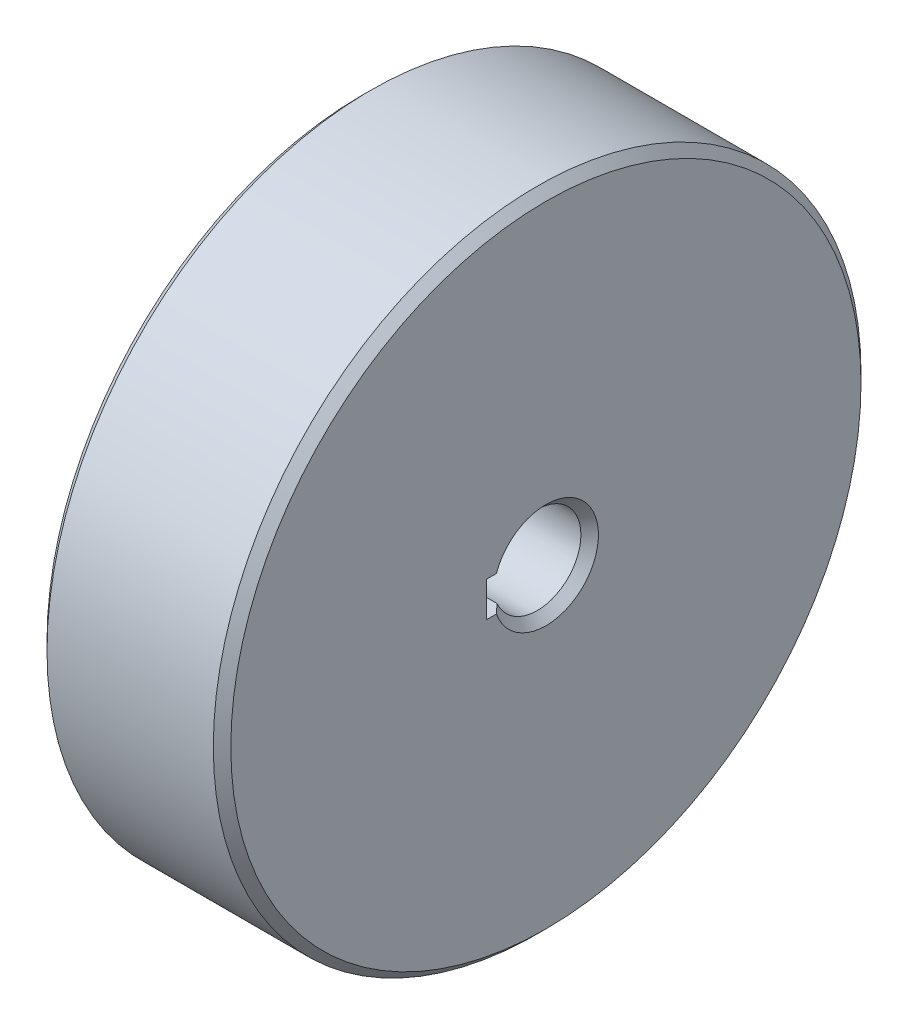
ISO-10303-21;
HEADER;
FILE_DESCRIPTION(('STEP AP214'),'2;1');
FILE_NAME('part.step','',(''),(''),'','','');
FILE_SCHEMA(('AUTOMOTIVE_DESIGN { 1 0 10303 214 1 1 1 1 }'));
ENDSEC;
DATA;
#1=APPLICATION_CONTEXT('core data for automotive mechanical design processes');
#2=APPLICATION_PROTOCOL_DEFINITION('international standard','automotive_design',2000,#1);
#3=PRODUCT_CONTEXT('',#1,'mechanical');
#4=PRODUCT('Part','Part','',(#3));
#5=PRODUCT_RELATED_PRODUCT_CATEGORY('part','',(#4));
#6=PRODUCT_DEFINITION_FORMATION('','',#4);
#7=PRODUCT_DEFINITION_CONTEXT('part definition',#1,'design');
#8=PRODUCT_DEFINITION('design','',#6,#7);
#9=PRODUCT_DEFINITION_SHAPE('','',#8);
#10=(LENGTH_UNIT() NAMED_UNIT(*) SI_UNIT(.MILLI.,.METRE.));
#11=(NAMED_UNIT(*) PLANE_ANGLE_UNIT() SI_UNIT($,.RADIAN.));
#12=(NAMED_UNIT(*) SI_UNIT($,.STERADIAN.) SOLID_ANGLE_UNIT());
#13=UNCERTAINTY_MEASURE_WITH_UNIT(LENGTH_MEASURE(1.E-05),#10,'distance_accuracy_value','');
#14=(GEOMETRIC_REPRESENTATION_CONTEXT(3) GLOBAL_UNCERTAINTY_ASSIGNED_CONTEXT((#13)) GLOBAL_UNIT_ASSIGNED_CONTEXT((#10,
#11,#12)) REPRESENTATION_CONTEXT('',''));
#15=CARTESIAN_POINT('',(0.,0.,0.));
#16=DIRECTION('',(0.,0.,1.));
#17=DIRECTION('',(1.,0.,0.));
#18=AXIS2_PLACEMENT_3D('',#15,#16,#17);
#19=CARTESIAN_POINT('',(0.,0.,37.));
#20=DIRECTION('',(-1.,0.,0.));
#21=DIRECTION('',(0.,0.,1.));
#22=AXIS2_PLACEMENT_3D('',#19,#20,#21);
#23=PLANE('',#22);
#24=CARTESIAN_POINT('',(0.,0.,0.));
#25=DIRECTION('',(-1.,0.,0.));
#26=DIRECTION('',(0.,0.,1.));
#27=AXIS2_PLACEMENT_3D('',#24,#25,#26);
#28=CIRCLE('',#27,36.);
#29=CARTESIAN_POINT('',(0.,0.,36.));
#30=VERTEX_POINT('',#29);
#31=EDGE_CURVE('E184',#30,#30,#28,.T.);
#32=ORIENTED_EDGE('',*,*,#31,.T.);
#33=EDGE_LOOP('',(#32));
#34=FACE_BOUND('',#33,.T.);
#35=DIRECTION('',(0.,0.,-1.));
#36=VECTOR('',#35,1.);
#37=CARTESIAN_POINT('',(0.,-2.,4.58257569495584));
#38=LINE('',#37,#36);
#39=CARTESIAN_POINT('',(0.,-2.,6.8));
#40=VERTEX_POINT('',#39);
#41=CARTESIAN_POINT('',(0.,-2.,5.65685424949237));
#42=VERTEX_POINT('',#41);
#43=EDGE_CURVE('E95',#40,#42,#38,.T.);
#44=ORIENTED_EDGE('',*,*,#43,.T.);
#45=CARTESIAN_POINT('',(0.,0.,0.));
#46=DIRECTION('',(-1.,0.,0.));
#47=DIRECTION('',(0.,0.,1.));
#48=AXIS2_PLACEMENT_3D('',#45,#46,#47);
#49=CIRCLE('',#48,5.99999999999999);
#50=CARTESIAN_POINT('',(0.,2.,5.65685424949237));
#51=VERTEX_POINT('',#50);
#52=EDGE_CURVE('E55',#42,#51,#49,.F.);
#53=ORIENTED_EDGE('',*,*,#52,.T.);
#54=DIRECTION('',(0.,0.,1.));
#55=VECTOR('',#54,1.);
#56=CARTESIAN_POINT('',(0.,2.,4.58257569495584));
#57=LINE('',#56,#55);
#58=CARTESIAN_POINT('',(0.,2.,6.8));
#59=VERTEX_POINT('',#58);
#60=EDGE_CURVE('E113',#51,#59,#57,.T.);
#61=ORIENTED_EDGE('',*,*,#60,.T.);
#62=DIRECTION('',(0.,-1.,0.));
#63=VECTOR('',#62,1.);
#64=CARTESIAN_POINT('',(0.,-2.,6.8));
#65=LINE('',#64,#63);
#66=EDGE_CURVE('E102',#59,#40,#65,.T.);
#67=ORIENTED_EDGE('',*,*,#66,.T.);
#68=EDGE_LOOP('',(#44,#53,#61,#67));
#69=FACE_BOUND('',#68,.T.);
#70=ADVANCED_FACE('F32',(#34,#69),#23,.T.);
#71=CARTESIAN_POINT('',(0.,0.,0.));
#72=DIRECTION('',(-1.,0.,0.));
#73=DIRECTION('',(0.,0.,1.));
#74=AXIS2_PLACEMENT_3D('',#71,#72,#73);
#75=CYLINDRICAL_SURFACE('',#74,5.);
#76=DIRECTION('',(-1.,0.,0.));
#77=VECTOR('',#76,1.);
#78=CARTESIAN_POINT('',(21.,2.,4.58257569495584));
#79=LINE('',#78,#77);
#80=CARTESIAN_POINT('',(20.,2.,4.58257569495584));
#81=VERTEX_POINT('',#80);
#82=CARTESIAN_POINT('',(0.999999999999982,2.,4.58257569495584));
#83=VERTEX_POINT('',#82);
#84=EDGE_CURVE('E103',#81,#83,#79,.T.);
#85=ORIENTED_EDGE('',*,*,#84,.T.);
#86=CARTESIAN_POINT('',(0.999999999999983,0.,0.));
#87=DIRECTION('',(-1.,0.,0.));
#88=DIRECTION('',(0.,0.,1.));
#89=AXIS2_PLACEMENT_3D('',#86,#87,#88);
#90=CIRCLE('',#89,5.);
#91=CARTESIAN_POINT('',(0.999999999999982,-2.,4.58257569495584));
#92=VERTEX_POINT('',#91);
#93=EDGE_CURVE('E124',#83,#92,#90,.T.);
#94=ORIENTED_EDGE('',*,*,#93,.T.);
#95=DIRECTION('',(-1.,0.,0.));
#96=VECTOR('',#95,1.);
#97=CARTESIAN_POINT('',(21.,-2.,4.58257569495584));
#98=LINE('',#97,#96);
#99=CARTESIAN_POINT('',(20.,-2.,4.58257569495584));
#100=VERTEX_POINT('',#99);
#101=EDGE_CURVE('E110',#100,#92,#98,.T.);
#102=ORIENTED_EDGE('',*,*,#101,.F.);
#103=CARTESIAN_POINT('',(20.,0.,0.));
#104=DIRECTION('',(1.,0.,0.));
#105=DIRECTION('',(0.,0.,-1.));
#106=AXIS2_PLACEMENT_3D('',#103,#104,#105);
#107=CIRCLE('',#106,5.);
#108=EDGE_CURVE('E122',#100,#81,#107,.T.);
#109=ORIENTED_EDGE('',*,*,#108,.T.);
#110=EDGE_LOOP('',(#85,#94,#102,#109));
#111=FACE_BOUND('',#110,.T.);
#112=ADVANCED_FACE('F174',(#111),#75,.F.);
#113=CARTESIAN_POINT('',(21.,0.,37.));
#114=DIRECTION('',(1.,0.,0.));
#115=DIRECTION('',(0.,0.,-1.));
#116=AXIS2_PLACEMENT_3D('',#113,#114,#115);
#117=PLANE('',#116);
#118=CARTESIAN_POINT('',(21.,0.,0.));
#119=DIRECTION('',(1.,0.,0.));
#120=DIRECTION('',(0.,0.,-1.));
#121=AXIS2_PLACEMENT_3D('',#118,#119,#120);
#122=CIRCLE('',#121,36.);
#123=CARTESIAN_POINT('',(21.,0.,-36.));
#124=VERTEX_POINT('',#123);
#125=EDGE_CURVE('E193',#124,#124,#122,.T.);
#126=ORIENTED_EDGE('',*,*,#125,.T.);
#127=EDGE_LOOP('',(#126));
#128=FACE_BOUND('',#127,.T.);
#129=DIRECTION('',(0.,0.,1.));
#130=VECTOR('',#129,1.);
#131=CARTESIAN_POINT('',(21.,2.,4.58257569495584));
#132=LINE('',#131,#130);
#133=CARTESIAN_POINT('',(21.,2.,5.65685424949237));
#134=VERTEX_POINT('',#133);
#135=CARTESIAN_POINT('',(21.,2.,6.8));
#136=VERTEX_POINT('',#135);
#137=EDGE_CURVE('E85',#134,#136,#132,.T.);
#138=ORIENTED_EDGE('',*,*,#137,.F.);
#139=CARTESIAN_POINT('',(21.,0.,0.));
#140=DIRECTION('',(1.,0.,0.));
#141=DIRECTION('',(0.,0.,-1.));
#142=AXIS2_PLACEMENT_3D('',#139,#140,#141);
#143=CIRCLE('',#142,5.99999999999999);
#144=CARTESIAN_POINT('',(21.,-2.,5.65685424949237));
#145=VERTEX_POINT('',#144);
#146=EDGE_CURVE('E192',#134,#145,#143,.F.);
#147=ORIENTED_EDGE('',*,*,#146,.T.);
#148=DIRECTION('',(0.,0.,-1.));
#149=VECTOR('',#148,1.);
#150=CARTESIAN_POINT('',(21.,-2.,4.58257569495584));
#151=LINE('',#150,#149);
#152=CARTESIAN_POINT('',(21.,-2.,6.8));
#153=VERTEX_POINT('',#152);
#154=EDGE_CURVE('E108',#153,#145,#151,.T.);
#155=ORIENTED_EDGE('',*,*,#154,.F.);
#156=DIRECTION('',(0.,-1.,0.));
#157=VECTOR('',#156,1.);
#158=CARTESIAN_POINT('',(21.,-2.,6.8));
#159=LINE('',#158,#157);
#160=EDGE_CURVE('E94',#136,#153,#159,.T.);
#161=ORIENTED_EDGE('',*,*,#160,.F.);
#162=EDGE_LOOP('',(#138,#147,#155,#161));
#163=FACE_BOUND('',#162,.T.);
#164=ADVANCED_FACE('F106',(#128,#163),#117,.T.);
#165=CARTESIAN_POINT('',(0.,0.,0.));
#166=DIRECTION('',(-1.,0.,0.));
#167=DIRECTION('',(0.,0.,1.));
#168=AXIS2_PLACEMENT_3D('',#165,#166,#167);
#169=CYLINDRICAL_SURFACE('',#168,37.);
#170=CARTESIAN_POINT('',(0.99999999999998,0.,0.));
#171=DIRECTION('',(-1.,0.,0.));
#172=DIRECTION('',(0.,0.,1.));
#173=AXIS2_PLACEMENT_3D('',#170,#171,#172);
#174=CIRCLE('',#173,37.);
#175=CARTESIAN_POINT('',(0.99999999999998,0.,37.));
#176=VERTEX_POINT('',#175);
#177=EDGE_CURVE('E11',#176,#176,#174,.F.);
#178=ORIENTED_EDGE('',*,*,#177,.T.);
#179=EDGE_LOOP('',(#178));
#180=FACE_BOUND('',#179,.T.);
#181=CARTESIAN_POINT('',(20.,0.,0.));
#182=DIRECTION('',(1.,0.,0.));
#183=DIRECTION('',(0.,0.,-1.));
#184=AXIS2_PLACEMENT_3D('',#181,#182,#183);
#185=CIRCLE('',#184,37.);
#186=CARTESIAN_POINT('',(20.,0.,-37.));
#187=VERTEX_POINT('',#186);
#188=EDGE_CURVE('E40',#187,#187,#185,.F.);
#189=ORIENTED_EDGE('',*,*,#188,.T.);
#190=EDGE_LOOP('',(#189));
#191=FACE_BOUND('',#190,.T.);
#192=ADVANCED_FACE('F167',(#180,#191),#169,.T.);
#193=CARTESIAN_POINT('',(21.,2.,4.58257569495584));
#194=DIRECTION('',(0.,-1.,0.));
#195=DIRECTION('',(0.,0.,-1.));
#196=AXIS2_PLACEMENT_3D('',#193,#194,#195);
#197=PLANE('',#196);
#198=ORIENTED_EDGE('',*,*,#60,.F.);
#199=CARTESIAN_POINT('',(0.,2.,5.65685424949237));
#200=CARTESIAN_POINT('',(0.0839014006342072,2.,5.56786120487213));
#201=CARTESIAN_POINT('',(0.167688589840237,2.,5.47876027711385));
#202=CARTESIAN_POINT('',(0.33499370676505,2.,5.30030806734234));
#203=CARTESIAN_POINT('',(0.418511637765293,2.,5.21095678840513));
#204=CARTESIAN_POINT('',(0.585239713582056,2.,5.03196683441876));
#205=CARTESIAN_POINT('',(0.668449857440861,2.,4.94232815847695));
#206=CARTESIAN_POINT('',(0.834509288964505,2.,4.76271520486747));
#207=CARTESIAN_POINT('',(0.91735857219489,2.,4.67274092310077));
#208=CARTESIAN_POINT('',(0.999999999999984,2.,4.58257569495584));
#209=B_SPLINE_CURVE_WITH_KNOTS('',3,(#199,#200,#201,#202,#203,#204,#205,#206,#207,#208),
.UNSPECIFIED.,.F.,.F.,(4,2,2,2,4),(0.,0.36692362358727,0.733842758431793,1.10076303402859,
1.4676878058948),.UNSPECIFIED.);
#210=EDGE_CURVE('E159',#51,#83,#209,.T.);
#211=ORIENTED_EDGE('',*,*,#210,.T.);
#212=ORIENTED_EDGE('',*,*,#84,.F.);
#213=CARTESIAN_POINT('',(20.,2.,4.58257569495584));
#214=CARTESIAN_POINT('',(20.0826414278051,2.,4.67274092310077));
#215=CARTESIAN_POINT('',(20.1654907110355,2.,4.76271520486747));
#216=CARTESIAN_POINT('',(20.3315501425591,2.,4.94232815847695));
#217=CARTESIAN_POINT('',(20.4147602864179,2.,5.03196683441876));
#218=CARTESIAN_POINT('',(20.5814883622347,2.,5.21095678840513));
#219=CARTESIAN_POINT('',(20.6650062932349,2.,5.30030806734233));
#220=CARTESIAN_POINT('',(20.8323114101598,2.,5.47876027711385));
#221=CARTESIAN_POINT('',(20.9160985993658,2.,5.56786120487213));
#222=CARTESIAN_POINT('',(21.,2.,5.65685424949237));
#223=B_SPLINE_CURVE_WITH_KNOTS('',3,(#213,#214,#215,#216,#217,#218,#219,#220,#221,#222),
.UNSPECIFIED.,.F.,.F.,(4,2,2,2,4),(0.,0.366924771866207,0.733845047463004,1.10076418230753,
1.4676878058948),.UNSPECIFIED.);
#224=EDGE_CURVE('E47',#81,#134,#223,.T.);
#225=ORIENTED_EDGE('',*,*,#224,.T.);
#226=ORIENTED_EDGE('',*,*,#137,.T.);
#227=DIRECTION('',(-1.,0.,0.));
#228=VECTOR('',#227,1.);
#229=CARTESIAN_POINT('',(21.,2.,6.8));
#230=LINE('',#229,#228);
#231=EDGE_CURVE('E88',#136,#59,#230,.T.);
#232=ORIENTED_EDGE('',*,*,#231,.T.);
#233=EDGE_LOOP('',(#198,#211,#212,#225,#226,#232));
#234=FACE_BOUND('',#233,.T.);
#235=ADVANCED_FACE('F87',(#234),#197,.T.);
#236=CARTESIAN_POINT('',(21.,-2.,6.8));
#237=DIRECTION('',(0.,0.,-1.));
#238=DIRECTION('',(-1.,0.,0.));
#239=AXIS2_PLACEMENT_3D('',#236,#237,#238);
#240=PLANE('',#239);
#241=ORIENTED_EDGE('',*,*,#66,.F.);
#242=ORIENTED_EDGE('',*,*,#231,.F.);
#243=ORIENTED_EDGE('',*,*,#160,.T.);
#244=DIRECTION('',(-1.,0.,0.));
#245=VECTOR('',#244,1.);
#246=CARTESIAN_POINT('',(21.,-2.,6.8));
#247=LINE('',#246,#245);
#248=EDGE_CURVE('E104',#153,#40,#247,.T.);
#249=ORIENTED_EDGE('',*,*,#248,.T.);
#250=EDGE_LOOP('',(#241,#242,#243,#249));
#251=FACE_BOUND('',#250,.T.);
#252=ADVANCED_FACE('F99',(#251),#240,.T.);
#253=CARTESIAN_POINT('',(21.,-2.,4.58257569495584));
#254=DIRECTION('',(0.,1.,0.));
#255=DIRECTION('',(0.,0.,1.));
#256=AXIS2_PLACEMENT_3D('',#253,#254,#255);
#257=PLANE('',#256);
#258=ORIENTED_EDGE('',*,*,#101,.T.);
#259=CARTESIAN_POINT('',(0.999999999999983,-2.,4.58257569495584));
#260=CARTESIAN_POINT('',(0.917358572194889,-2.,4.67274092310077));
#261=CARTESIAN_POINT('',(0.834509288964505,-2.,4.76271520486747));
#262=CARTESIAN_POINT('',(0.66844985744086,-2.,4.94232815847695));
#263=CARTESIAN_POINT('',(0.585239713582056,-2.,5.03196683441876));
#264=CARTESIAN_POINT('',(0.418511637765293,-2.,5.21095678840513));
#265=CARTESIAN_POINT('',(0.33499370676505,-2.,5.30030806734234));
#266=CARTESIAN_POINT('',(0.167688589840237,-2.,5.47876027711385));
#267=CARTESIAN_POINT('',(0.0839014006342075,-2.,5.56786120487213));
#268=CARTESIAN_POINT('',(0.,-2.,5.65685424949237));
#269=B_SPLINE_CURVE_WITH_KNOTS('',3,(#259,#260,#261,#262,#263,#264,#265,#266,#267,#268),
.UNSPECIFIED.,.F.,.F.,(4,2,2,2,4),(0.,0.366924771866206,0.733845047463001,1.10076418230753,
1.46768780589479),.UNSPECIFIED.);
#270=EDGE_CURVE('E134',#92,#42,#269,.T.);
#271=ORIENTED_EDGE('',*,*,#270,.T.);
#272=ORIENTED_EDGE('',*,*,#43,.F.);
#273=ORIENTED_EDGE('',*,*,#248,.F.);
#274=ORIENTED_EDGE('',*,*,#154,.T.);
#275=CARTESIAN_POINT('',(21.,-2.,5.65685424949237));
#276=CARTESIAN_POINT('',(20.9160985993658,-2.,5.56786120487213));
#277=CARTESIAN_POINT('',(20.8323114101598,-2.,5.47876027711385));
#278=CARTESIAN_POINT('',(20.6650062932349,-2.,5.30030806734234));
#279=CARTESIAN_POINT('',(20.5814883622347,-2.,5.21095678840513));
#280=CARTESIAN_POINT('',(20.4147602864179,-2.,5.03196683441876));
#281=CARTESIAN_POINT('',(20.3315501425591,-2.,4.94232815847695));
#282=CARTESIAN_POINT('',(20.1654907110355,-2.,4.76271520486747));
#283=CARTESIAN_POINT('',(20.0826414278051,-2.,4.67274092310077));
#284=CARTESIAN_POINT('',(20.,-2.,4.58257569495584));
#285=B_SPLINE_CURVE_WITH_KNOTS('',3,(#275,#276,#277,#278,#279,#280,#281,#282,#283,#284),
.UNSPECIFIED.,.F.,.F.,(4,2,2,2,4),(0.,0.366923623587272,0.733842758431797,1.10076303402859,
1.4676878058948),.UNSPECIFIED.);
#286=EDGE_CURVE('E127',#145,#100,#285,.T.);
#287=ORIENTED_EDGE('',*,*,#286,.T.);
#288=EDGE_LOOP('',(#258,#271,#272,#273,#274,#287));
#289=FACE_BOUND('',#288,.T.);
#290=ADVANCED_FACE('F140',(#289),#257,.T.);
#291=CARTESIAN_POINT('',(0.999999999999983,0.,0.));
#292=DIRECTION('',(-1.,0.,0.));
#293=DIRECTION('',(0.,0.,1.));
#294=AXIS2_PLACEMENT_3D('',#291,#292,#293);
#295=CONICAL_SURFACE('',#294,5.,0.785398163397454);
#296=ORIENTED_EDGE('',*,*,#210,.F.);
#297=ORIENTED_EDGE('',*,*,#52,.F.);
#298=ORIENTED_EDGE('',*,*,#270,.F.);
#299=ORIENTED_EDGE('',*,*,#93,.F.);
#300=EDGE_LOOP('',(#296,#297,#298,#299));
#301=FACE_BOUND('',#300,.T.);
#302=ADVANCED_FACE('F147',(#301),#295,.F.);
#303=CARTESIAN_POINT('',(21.,0.,0.));
#304=DIRECTION('',(1.,0.,0.));
#305=DIRECTION('',(0.,0.,-1.));
#306=AXIS2_PLACEMENT_3D('',#303,#304,#305);
#307=CONICAL_SURFACE('',#306,5.99999999999999,0.78539816339745);
#308=ORIENTED_EDGE('',*,*,#224,.F.);
#309=ORIENTED_EDGE('',*,*,#108,.F.);
#310=ORIENTED_EDGE('',*,*,#286,.F.);
#311=ORIENTED_EDGE('',*,*,#146,.F.);
#312=EDGE_LOOP('',(#308,#309,#310,#311));
#313=FACE_BOUND('',#312,.T.);
#314=ADVANCED_FACE('F143',(#313),#307,.F.);
#315=CARTESIAN_POINT('',(0.,0.,0.));
#316=DIRECTION('',(1.,0.,0.));
#317=DIRECTION('',(0.,0.,-1.));
#318=AXIS2_PLACEMENT_3D('',#315,#316,#317);
#319=CONICAL_SURFACE('',#318,36.,0.785398163397448);
#320=ORIENTED_EDGE('',*,*,#177,.F.);
#321=EDGE_LOOP('',(#320));
#322=FACE_BOUND('',#321,.T.);
#323=ORIENTED_EDGE('',*,*,#31,.F.);
#324=EDGE_LOOP('',(#323));
#325=FACE_BOUND('',#324,.T.);
#326=ADVANCED_FACE('F146',(#322,#325),#319,.T.);
#327=CARTESIAN_POINT('',(20.,0.,0.));
#328=DIRECTION('',(-1.,0.,0.));
#329=DIRECTION('',(0.,0.,1.));
#330=AXIS2_PLACEMENT_3D('',#327,#328,#329);
#331=CONICAL_SURFACE('',#330,37.,0.785398163397452);
#332=ORIENTED_EDGE('',*,*,#125,.F.);
#333=EDGE_LOOP('',(#332));
#334=FACE_BOUND('',#333,.T.);
#335=ORIENTED_EDGE('',*,*,#188,.F.);
#336=EDGE_LOOP('',(#335));
#337=FACE_BOUND('',#336,.T.);
#338=ADVANCED_FACE('F34',(#334,#337),#331,.T.);
#339=CLOSED_SHELL('',(#70,#112,#164,#192,#235,#252,#290,#302,#314,#326,#338));
#340=MANIFOLD_SOLID_BREP('B2',#339);
#341=ADVANCED_BREP_SHAPE_REPRESENTATION('',(#18,#340),#14);
#342=SHAPE_DEFINITION_REPRESENTATION(#9,#341);
ENDSEC;
END-ISO-10303-21;
